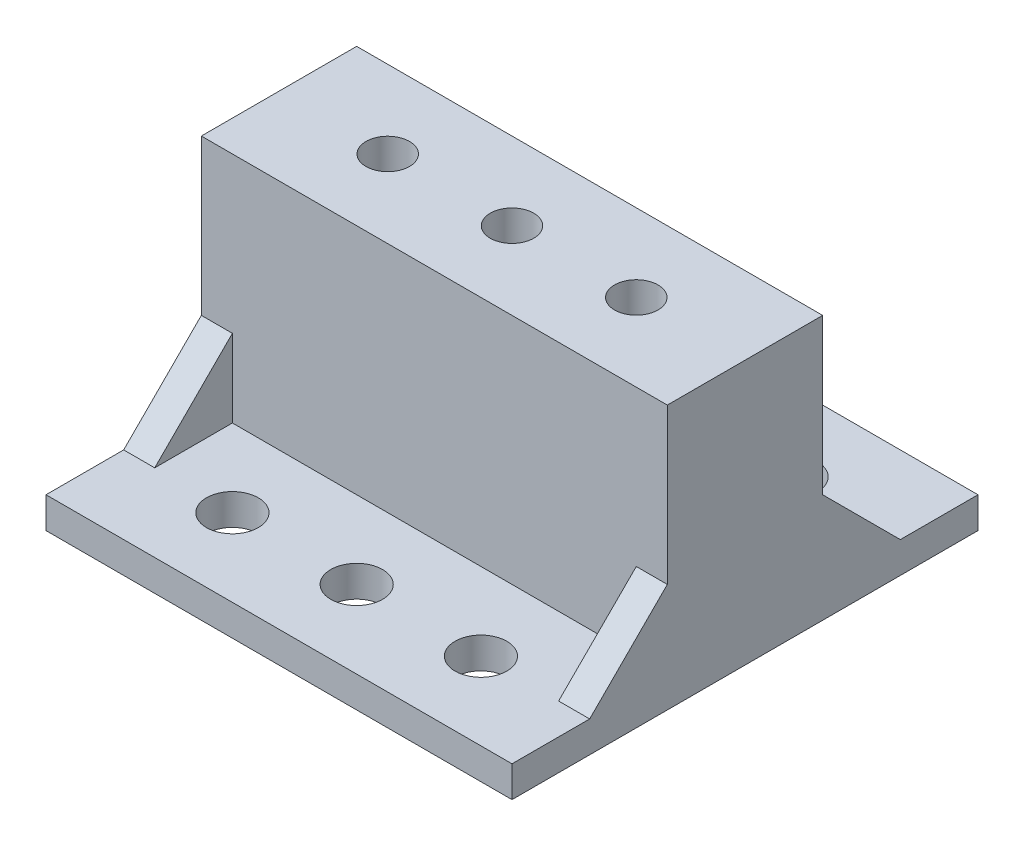
ISO-10303-21;
HEADER;
FILE_DESCRIPTION(('STEP AP214'),'2;1');
FILE_NAME('part.step','',(''),(''),'','','');
FILE_SCHEMA(('AUTOMOTIVE_DESIGN { 1 0 10303 214 1 1 1 1 }'));
ENDSEC;
DATA;
#1=APPLICATION_CONTEXT('core data for automotive mechanical design processes');
#2=APPLICATION_PROTOCOL_DEFINITION('international standard','automotive_design',2000,#1);
#3=PRODUCT_CONTEXT('',#1,'mechanical');
#4=PRODUCT('Part','Part','',(#3));
#5=PRODUCT_RELATED_PRODUCT_CATEGORY('part','',(#4));
#6=PRODUCT_DEFINITION_FORMATION('','',#4);
#7=PRODUCT_DEFINITION_CONTEXT('part definition',#1,'design');
#8=PRODUCT_DEFINITION('design','',#6,#7);
#9=PRODUCT_DEFINITION_SHAPE('','',#8);
#10=(LENGTH_UNIT() NAMED_UNIT(*) SI_UNIT(.MILLI.,.METRE.));
#11=(NAMED_UNIT(*) PLANE_ANGLE_UNIT() SI_UNIT($,.RADIAN.));
#12=(NAMED_UNIT(*) SI_UNIT($,.STERADIAN.) SOLID_ANGLE_UNIT());
#13=UNCERTAINTY_MEASURE_WITH_UNIT(LENGTH_MEASURE(1.E-05),#10,'distance_accuracy_value','');
#14=(GEOMETRIC_REPRESENTATION_CONTEXT(3) GLOBAL_UNCERTAINTY_ASSIGNED_CONTEXT((#13)) GLOBAL_UNIT_ASSIGNED_CONTEXT((#10,
#11,#12)) REPRESENTATION_CONTEXT('',''));
#15=CARTESIAN_POINT('',(0.,0.,0.));
#16=DIRECTION('',(0.,0.,1.));
#17=DIRECTION('',(1.,0.,0.));
#18=AXIS2_PLACEMENT_3D('',#15,#16,#17);
#19=CARTESIAN_POINT('',(0.,3.,0.));
#20=DIRECTION('',(0.,1.,0.));
#21=DIRECTION('',(0.,0.,1.));
#22=AXIS2_PLACEMENT_3D('',#19,#20,#21);
#23=PLANE('',#22);
#24=CARTESIAN_POINT('',(12.,3.,-15.));
#25=DIRECTION('',(0.,-1.,0.));
#26=DIRECTION('',(0.,0.,-1.));
#27=AXIS2_PLACEMENT_3D('',#24,#25,#26);
#28=CIRCLE('',#27,2.5);
#29=CARTESIAN_POINT('',(12.,3.,-17.5));
#30=VERTEX_POINT('',#29);
#31=EDGE_CURVE('E204',#30,#30,#28,.T.);
#32=ORIENTED_EDGE('',*,*,#31,.T.);
#33=EDGE_LOOP('',(#32));
#34=FACE_BOUND('',#33,.T.);
#35=CARTESIAN_POINT('',(-12.,3.,-15.));
#36=DIRECTION('',(0.,-1.,0.));
#37=DIRECTION('',(0.,0.,-1.));
#38=AXIS2_PLACEMENT_3D('',#35,#36,#37);
#39=CIRCLE('',#38,2.5);
#40=CARTESIAN_POINT('',(-12.,3.,-17.5));
#41=VERTEX_POINT('',#40);
#42=EDGE_CURVE('E210',#41,#41,#39,.T.);
#43=ORIENTED_EDGE('',*,*,#42,.T.);
#44=EDGE_LOOP('',(#43));
#45=FACE_BOUND('',#44,.T.);
#46=CARTESIAN_POINT('',(0.,3.,-15.));
#47=DIRECTION('',(0.,-1.,0.));
#48=DIRECTION('',(0.,0.,-1.));
#49=AXIS2_PLACEMENT_3D('',#46,#47,#48);
#50=CIRCLE('',#49,2.5);
#51=CARTESIAN_POINT('',(0.,3.,-17.5));
#52=VERTEX_POINT('',#51);
#53=EDGE_CURVE('E209',#52,#52,#50,.T.);
#54=ORIENTED_EDGE('',*,*,#53,.T.);
#55=EDGE_LOOP('',(#54));
#56=FACE_BOUND('',#55,.T.);
#57=DIRECTION('',(0.,0.,1.));
#58=VECTOR('',#57,1.);
#59=CARTESIAN_POINT('',(-22.5,3.,-22.5));
#60=LINE('',#59,#58);
#61=CARTESIAN_POINT('',(-22.5,3.,-22.5));
#62=VERTEX_POINT('',#61);
#63=CARTESIAN_POINT('',(-22.5,3.,-15.));
#64=VERTEX_POINT('',#63);
#65=EDGE_CURVE('E375',#62,#64,#60,.T.);
#66=ORIENTED_EDGE('',*,*,#65,.T.);
#67=DIRECTION('',(-1.,0.,0.));
#68=VECTOR('',#67,1.);
#69=CARTESIAN_POINT('',(-19.5,3.,-15.));
#70=LINE('',#69,#68);
#71=CARTESIAN_POINT('',(-19.5,3.,-15.));
#72=VERTEX_POINT('',#71);
#73=EDGE_CURVE('E265',#72,#64,#70,.T.);
#74=ORIENTED_EDGE('',*,*,#73,.F.);
#75=DIRECTION('',(0.,0.,-1.));
#76=VECTOR('',#75,1.);
#77=CARTESIAN_POINT('',(-19.5,3.,-7.49999999999998));
#78=LINE('',#77,#76);
#79=CARTESIAN_POINT('',(-19.5,3.,-7.49999999999998));
#80=VERTEX_POINT('',#79);
#81=EDGE_CURVE('E259',#80,#72,#78,.T.);
#82=ORIENTED_EDGE('',*,*,#81,.F.);
#83=DIRECTION('',(-1.,0.,0.));
#84=VECTOR('',#83,1.);
#85=CARTESIAN_POINT('',(22.5,3.,-7.49999999999999));
#86=LINE('',#85,#84);
#87=CARTESIAN_POINT('',(19.5,3.,-7.49999999999999));
#88=VERTEX_POINT('',#87);
#89=EDGE_CURVE('E336',#88,#80,#86,.T.);
#90=ORIENTED_EDGE('',*,*,#89,.F.);
#91=DIRECTION('',(0.,0.,-1.));
#92=VECTOR('',#91,1.);
#93=CARTESIAN_POINT('',(19.5,3.,-7.49999999999998));
#94=LINE('',#93,#92);
#95=CARTESIAN_POINT('',(19.5,3.,-15.));
#96=VERTEX_POINT('',#95);
#97=EDGE_CURVE('E67',#88,#96,#94,.T.);
#98=ORIENTED_EDGE('',*,*,#97,.T.);
#99=DIRECTION('',(1.,0.,0.));
#100=VECTOR('',#99,1.);
#101=CARTESIAN_POINT('',(19.5,3.,-15.));
#102=LINE('',#101,#100);
#103=CARTESIAN_POINT('',(22.5,3.,-15.));
#104=VERTEX_POINT('',#103);
#105=EDGE_CURVE('E71',#96,#104,#102,.T.);
#106=ORIENTED_EDGE('',*,*,#105,.T.);
#107=DIRECTION('',(0.,0.,-1.));
#108=VECTOR('',#107,1.);
#109=CARTESIAN_POINT('',(22.5,3.,-22.5));
#110=LINE('',#109,#108);
#111=CARTESIAN_POINT('',(22.5,3.,-22.5));
#112=VERTEX_POINT('',#111);
#113=EDGE_CURVE('E371',#104,#112,#110,.T.);
#114=ORIENTED_EDGE('',*,*,#113,.T.);
#115=DIRECTION('',(-1.,0.,0.));
#116=VECTOR('',#115,1.);
#117=CARTESIAN_POINT('',(-22.5,3.,-22.5));
#118=LINE('',#117,#116);
#119=EDGE_CURVE('E370',#112,#62,#118,.T.);
#120=ORIENTED_EDGE('',*,*,#119,.T.);
#121=EDGE_LOOP('',(#66,#74,#82,#90,#98,#106,#114,#120));
#122=FACE_BOUND('',#121,.T.);
#123=ADVANCED_FACE('F51',(#34,#45,#56,#122),#23,.T.);
#124=CARTESIAN_POINT('',(22.5,25.5,-7.49999999999999));
#125=DIRECTION('',(0.,0.,1.));
#126=DIRECTION('',(1.,0.,0.));
#127=AXIS2_PLACEMENT_3D('',#124,#125,#126);
#128=PLANE('',#127);
#129=DIRECTION('',(-1.,0.,0.));
#130=VECTOR('',#129,1.);
#131=CARTESIAN_POINT('',(-19.5,10.4999999999999,-7.49999999999999));
#132=LINE('',#131,#130);
#133=CARTESIAN_POINT('',(-19.5,10.4999999999999,-7.49999999999999));
#134=VERTEX_POINT('',#133);
#135=CARTESIAN_POINT('',(-22.5,10.4999999999999,-7.49999999999999));
#136=VERTEX_POINT('',#135);
#137=EDGE_CURVE('E262',#134,#136,#132,.T.);
#138=ORIENTED_EDGE('',*,*,#137,.T.);
#139=DIRECTION('',(0.,-1.,0.));
#140=VECTOR('',#139,1.);
#141=CARTESIAN_POINT('',(-22.5,25.5,-7.49999999999999));
#142=LINE('',#141,#140);
#143=CARTESIAN_POINT('',(-22.5,25.5,-7.49999999999999));
#144=VERTEX_POINT('',#143);
#145=EDGE_CURVE('E345',#144,#136,#142,.T.);
#146=ORIENTED_EDGE('',*,*,#145,.F.);
#147=DIRECTION('',(-1.,0.,0.));
#148=VECTOR('',#147,1.);
#149=CARTESIAN_POINT('',(22.5,25.5,-7.49999999999999));
#150=LINE('',#149,#148);
#151=CARTESIAN_POINT('',(22.5,25.5,-7.49999999999999));
#152=VERTEX_POINT('',#151);
#153=EDGE_CURVE('E342',#152,#144,#150,.T.);
#154=ORIENTED_EDGE('',*,*,#153,.F.);
#155=DIRECTION('',(0.,-1.,0.));
#156=VECTOR('',#155,1.);
#157=CARTESIAN_POINT('',(22.5,25.5,-7.49999999999999));
#158=LINE('',#157,#156);
#159=CARTESIAN_POINT('',(22.5,10.4999999999999,-7.49999999999999));
#160=VERTEX_POINT('',#159);
#161=EDGE_CURVE('E355',#152,#160,#158,.T.);
#162=ORIENTED_EDGE('',*,*,#161,.T.);
#163=DIRECTION('',(1.,0.,0.));
#164=VECTOR('',#163,1.);
#165=CARTESIAN_POINT('',(19.5,10.4999999999999,-7.49999999999999));
#166=LINE('',#165,#164);
#167=CARTESIAN_POINT('',(19.5,10.4999999999999,-7.49999999999999));
#168=VERTEX_POINT('',#167);
#169=EDGE_CURVE('E284',#168,#160,#166,.T.);
#170=ORIENTED_EDGE('',*,*,#169,.F.);
#171=DIRECTION('',(0.,-1.,0.));
#172=VECTOR('',#171,1.);
#173=CARTESIAN_POINT('',(19.5,10.4999999999999,-7.49999999999999));
#174=LINE('',#173,#172);
#175=EDGE_CURVE('E272',#168,#88,#174,.T.);
#176=ORIENTED_EDGE('',*,*,#175,.T.);
#177=ORIENTED_EDGE('',*,*,#89,.T.);
#178=DIRECTION('',(0.,-1.,0.));
#179=VECTOR('',#178,1.);
#180=CARTESIAN_POINT('',(-19.5,10.4999999999999,-7.49999999999999));
#181=LINE('',#180,#179);
#182=EDGE_CURVE('E253',#134,#80,#181,.T.);
#183=ORIENTED_EDGE('',*,*,#182,.F.);
#184=EDGE_LOOP('',(#138,#146,#154,#162,#170,#176,#177,#183));
#185=FACE_BOUND('',#184,.T.);
#186=ADVANCED_FACE('F443',(#185),#128,.F.);
#187=CARTESIAN_POINT('',(12.,3.,15.));
#188=DIRECTION('',(0.,1.,0.));
#189=DIRECTION('',(0.,0.,1.));
#190=AXIS2_PLACEMENT_3D('',#187,#188,#189);
#191=CIRCLE('',#190,2.5);
#192=CARTESIAN_POINT('',(12.,3.,17.5));
#193=VERTEX_POINT('',#192);
#194=EDGE_CURVE('E225',#193,#193,#191,.T.);
#195=ORIENTED_EDGE('',*,*,#194,.F.);
#196=EDGE_LOOP('',(#195));
#197=FACE_BOUND('',#196,.T.);
#198=CARTESIAN_POINT('',(-12.,3.,15.));
#199=DIRECTION('',(0.,1.,0.));
#200=DIRECTION('',(0.,0.,1.));
#201=AXIS2_PLACEMENT_3D('',#198,#199,#200);
#202=CIRCLE('',#201,2.5);
#203=CARTESIAN_POINT('',(-12.,3.,17.5));
#204=VERTEX_POINT('',#203);
#205=EDGE_CURVE('E234',#204,#204,#202,.T.);
#206=ORIENTED_EDGE('',*,*,#205,.F.);
#207=EDGE_LOOP('',(#206));
#208=FACE_BOUND('',#207,.T.);
#209=CARTESIAN_POINT('',(0.,3.,15.));
#210=DIRECTION('',(0.,1.,0.));
#211=DIRECTION('',(0.,0.,1.));
#212=AXIS2_PLACEMENT_3D('',#209,#210,#211);
#213=CIRCLE('',#212,2.5);
#214=CARTESIAN_POINT('',(0.,3.,17.5));
#215=VERTEX_POINT('',#214);
#216=EDGE_CURVE('E233',#215,#215,#213,.T.);
#217=ORIENTED_EDGE('',*,*,#216,.F.);
#218=EDGE_LOOP('',(#217));
#219=FACE_BOUND('',#218,.T.);
#220=CARTESIAN_POINT('',(22.5,3.,22.5));
#221=VERTEX_POINT('',#220);
#222=CARTESIAN_POINT('',(22.5,3.,15.));
#223=VERTEX_POINT('',#222);
#224=EDGE_CURVE('E366',#221,#223,#110,.T.);
#225=ORIENTED_EDGE('',*,*,#224,.T.);
#226=DIRECTION('',(1.,0.,0.));
#227=VECTOR('',#226,1.);
#228=CARTESIAN_POINT('',(19.5,3.,15.));
#229=LINE('',#228,#227);
#230=CARTESIAN_POINT('',(19.5,3.,15.));
#231=VERTEX_POINT('',#230);
#232=EDGE_CURVE('E303',#231,#223,#229,.T.);
#233=ORIENTED_EDGE('',*,*,#232,.F.);
#234=DIRECTION('',(0.,0.,1.));
#235=VECTOR('',#234,1.);
#236=CARTESIAN_POINT('',(19.5,3.,7.49999999999998));
#237=LINE('',#236,#235);
#238=CARTESIAN_POINT('',(19.5,3.,7.49999999999998));
#239=VERTEX_POINT('',#238);
#240=EDGE_CURVE('E297',#239,#231,#237,.T.);
#241=ORIENTED_EDGE('',*,*,#240,.F.);
#242=DIRECTION('',(1.,0.,0.));
#243=VECTOR('',#242,1.);
#244=CARTESIAN_POINT('',(22.5,3.,7.49999999999999));
#245=LINE('',#244,#243);
#246=CARTESIAN_POINT('',(-19.5,3.,7.49999999999999));
#247=VERTEX_POINT('',#246);
#248=EDGE_CURVE('E328',#247,#239,#245,.T.);
#249=ORIENTED_EDGE('',*,*,#248,.F.);
#250=DIRECTION('',(0.,0.,1.));
#251=VECTOR('',#250,1.);
#252=CARTESIAN_POINT('',(-19.5,3.,7.49999999999998));
#253=LINE('',#252,#251);
#254=CARTESIAN_POINT('',(-19.5,3.,15.));
#255=VERTEX_POINT('',#254);
#256=EDGE_CURVE('E313',#247,#255,#253,.T.);
#257=ORIENTED_EDGE('',*,*,#256,.T.);
#258=DIRECTION('',(-1.,0.,0.));
#259=VECTOR('',#258,1.);
#260=CARTESIAN_POINT('',(-19.5,3.,15.));
#261=LINE('',#260,#259);
#262=CARTESIAN_POINT('',(-22.5,3.,15.));
#263=VERTEX_POINT('',#262);
#264=EDGE_CURVE('E320',#255,#263,#261,.T.);
#265=ORIENTED_EDGE('',*,*,#264,.T.);
#266=CARTESIAN_POINT('',(-22.5,3.,22.5));
#267=VERTEX_POINT('',#266);
#268=EDGE_CURVE('E374',#263,#267,#60,.T.);
#269=ORIENTED_EDGE('',*,*,#268,.T.);
#270=DIRECTION('',(1.,0.,0.));
#271=VECTOR('',#270,1.);
#272=CARTESIAN_POINT('',(-22.5,3.,22.5));
#273=LINE('',#272,#271);
#274=EDGE_CURVE('E379',#267,#221,#273,.T.);
#275=ORIENTED_EDGE('',*,*,#274,.T.);
#276=EDGE_LOOP('',(#225,#233,#241,#249,#257,#265,#269,#275));
#277=FACE_BOUND('',#276,.T.);
#278=ADVANCED_FACE('F426',(#197,#208,#219,#277),#23,.T.);
#279=CARTESIAN_POINT('',(22.5,25.5,7.49999999999999));
#280=DIRECTION('',(0.,0.,-1.));
#281=DIRECTION('',(-1.,0.,0.));
#282=AXIS2_PLACEMENT_3D('',#279,#280,#281);
#283=PLANE('',#282);
#284=DIRECTION('',(1.,0.,0.));
#285=VECTOR('',#284,1.);
#286=CARTESIAN_POINT('',(19.5,10.4999999999999,7.49999999999999));
#287=LINE('',#286,#285);
#288=CARTESIAN_POINT('',(19.5,10.4999999999999,7.49999999999999));
#289=VERTEX_POINT('',#288);
#290=CARTESIAN_POINT('',(22.5,10.4999999999999,7.49999999999999));
#291=VERTEX_POINT('',#290);
#292=EDGE_CURVE('E300',#289,#291,#287,.T.);
#293=ORIENTED_EDGE('',*,*,#292,.T.);
#294=DIRECTION('',(0.,-1.,0.));
#295=VECTOR('',#294,1.);
#296=CARTESIAN_POINT('',(22.5,25.5,7.49999999999999));
#297=LINE('',#296,#295);
#298=CARTESIAN_POINT('',(22.5,25.5,7.49999999999999));
#299=VERTEX_POINT('',#298);
#300=EDGE_CURVE('E358',#299,#291,#297,.T.);
#301=ORIENTED_EDGE('',*,*,#300,.F.);
#302=DIRECTION('',(1.,0.,0.));
#303=VECTOR('',#302,1.);
#304=CARTESIAN_POINT('',(22.5,25.5,7.49999999999999));
#305=LINE('',#304,#303);
#306=CARTESIAN_POINT('',(-22.5,25.5,7.49999999999999));
#307=VERTEX_POINT('',#306);
#308=EDGE_CURVE('E335',#307,#299,#305,.T.);
#309=ORIENTED_EDGE('',*,*,#308,.F.);
#310=DIRECTION('',(0.,-1.,0.));
#311=VECTOR('',#310,1.);
#312=CARTESIAN_POINT('',(-22.5,25.5,7.49999999999999));
#313=LINE('',#312,#311);
#314=CARTESIAN_POINT('',(-22.5,10.4999999999999,7.49999999999999));
#315=VERTEX_POINT('',#314);
#316=EDGE_CURVE('E362',#307,#315,#313,.T.);
#317=ORIENTED_EDGE('',*,*,#316,.T.);
#318=DIRECTION('',(-1.,0.,0.));
#319=VECTOR('',#318,1.);
#320=CARTESIAN_POINT('',(-19.5,10.4999999999999,7.49999999999999));
#321=LINE('',#320,#319);
#322=CARTESIAN_POINT('',(-19.5,10.4999999999999,7.49999999999999));
#323=VERTEX_POINT('',#322);
#324=EDGE_CURVE('E324',#323,#315,#321,.T.);
#325=ORIENTED_EDGE('',*,*,#324,.F.);
#326=DIRECTION('',(0.,-1.,0.));
#327=VECTOR('',#326,1.);
#328=CARTESIAN_POINT('',(-19.5,10.4999999999999,7.49999999999999));
#329=LINE('',#328,#327);
#330=EDGE_CURVE('E310',#323,#247,#329,.T.);
#331=ORIENTED_EDGE('',*,*,#330,.T.);
#332=ORIENTED_EDGE('',*,*,#248,.T.);
#333=DIRECTION('',(0.,-1.,0.));
#334=VECTOR('',#333,1.);
#335=CARTESIAN_POINT('',(19.5,10.4999999999999,7.49999999999999));
#336=LINE('',#335,#334);
#337=EDGE_CURVE('E291',#289,#239,#336,.T.);
#338=ORIENTED_EDGE('',*,*,#337,.F.);
#339=EDGE_LOOP('',(#293,#301,#309,#317,#325,#331,#332,#338));
#340=FACE_BOUND('',#339,.T.);
#341=ADVANCED_FACE('F441',(#340),#283,.F.);
#342=CARTESIAN_POINT('',(22.5,3.,-22.5));
#343=DIRECTION('',(-1.,0.,0.));
#344=DIRECTION('',(0.,0.,1.));
#345=AXIS2_PLACEMENT_3D('',#342,#343,#344);
#346=PLANE('',#345);
#347=ORIENTED_EDGE('',*,*,#113,.F.);
#348=DIRECTION('',(0.,0.707106781186544,0.707106781186552));
#349=VECTOR('',#348,1.);
#350=CARTESIAN_POINT('',(22.5,3.,-15.));
#351=LINE('',#350,#349);
#352=EDGE_CURVE('E268',#104,#160,#351,.T.);
#353=ORIENTED_EDGE('',*,*,#352,.T.);
#354=ORIENTED_EDGE('',*,*,#161,.F.);
#355=DIRECTION('',(0.,0.,-1.));
#356=VECTOR('',#355,1.);
#357=CARTESIAN_POINT('',(22.5,25.5,-7.49999999999999));
#358=LINE('',#357,#356);
#359=EDGE_CURVE('E339',#299,#152,#358,.T.);
#360=ORIENTED_EDGE('',*,*,#359,.F.);
#361=ORIENTED_EDGE('',*,*,#300,.T.);
#362=DIRECTION('',(0.,0.707106781186544,-0.707106781186552));
#363=VECTOR('',#362,1.);
#364=CARTESIAN_POINT('',(22.5,3.,15.));
#365=LINE('',#364,#363);
#366=EDGE_CURVE('E288',#223,#291,#365,.T.);
#367=ORIENTED_EDGE('',*,*,#366,.F.);
#368=ORIENTED_EDGE('',*,*,#224,.F.);
#369=DIRECTION('',(0.,-1.,0.));
#370=VECTOR('',#369,1.);
#371=CARTESIAN_POINT('',(22.5,3.,22.5));
#372=LINE('',#371,#370);
#373=CARTESIAN_POINT('',(22.5,0.,22.5));
#374=VERTEX_POINT('',#373);
#375=EDGE_CURVE('E382',#221,#374,#372,.T.);
#376=ORIENTED_EDGE('',*,*,#375,.T.);
#377=DIRECTION('',(0.,0.,-1.));
#378=VECTOR('',#377,1.);
#379=CARTESIAN_POINT('',(22.5,0.,-22.5));
#380=LINE('',#379,#378);
#381=CARTESIAN_POINT('',(22.5,0.,-22.5));
#382=VERTEX_POINT('',#381);
#383=EDGE_CURVE('E365',#374,#382,#380,.T.);
#384=ORIENTED_EDGE('',*,*,#383,.T.);
#385=DIRECTION('',(0.,-1.,0.));
#386=VECTOR('',#385,1.);
#387=CARTESIAN_POINT('',(22.5,3.,-22.5));
#388=LINE('',#387,#386);
#389=EDGE_CURVE('E13',#112,#382,#388,.T.);
#390=ORIENTED_EDGE('',*,*,#389,.F.);
#391=EDGE_LOOP('',(#347,#353,#354,#360,#361,#367,#368,#376,#384,#390));
#392=FACE_BOUND('',#391,.T.);
#393=ADVANCED_FACE('F53',(#392),#346,.F.);
#394=CARTESIAN_POINT('',(-22.5,3.,-22.5));
#395=DIRECTION('',(0.,0.,1.));
#396=DIRECTION('',(1.,0.,0.));
#397=AXIS2_PLACEMENT_3D('',#394,#395,#396);
#398=PLANE('',#397);
#399=DIRECTION('',(-1.,0.,0.));
#400=VECTOR('',#399,1.);
#401=CARTESIAN_POINT('',(-22.5,0.,-22.5));
#402=LINE('',#401,#400);
#403=CARTESIAN_POINT('',(-22.5,0.,-22.5));
#404=VERTEX_POINT('',#403);
#405=EDGE_CURVE('E386',#382,#404,#402,.T.);
#406=ORIENTED_EDGE('',*,*,#405,.T.);
#407=DIRECTION('',(0.,-1.,0.));
#408=VECTOR('',#407,1.);
#409=CARTESIAN_POINT('',(-22.5,3.,-22.5));
#410=LINE('',#409,#408);
#411=EDGE_CURVE('E60',#62,#404,#410,.T.);
#412=ORIENTED_EDGE('',*,*,#411,.F.);
#413=ORIENTED_EDGE('',*,*,#119,.F.);
#414=ORIENTED_EDGE('',*,*,#389,.T.);
#415=EDGE_LOOP('',(#406,#412,#413,#414));
#416=FACE_BOUND('',#415,.T.);
#417=ADVANCED_FACE('F434',(#416),#398,.F.);
#418=CARTESIAN_POINT('',(-22.5,3.,-22.5));
#419=DIRECTION('',(1.,0.,0.));
#420=DIRECTION('',(0.,0.,-1.));
#421=AXIS2_PLACEMENT_3D('',#418,#419,#420);
#422=PLANE('',#421);
#423=DIRECTION('',(0.,0.707106781186544,0.707106781186552));
#424=VECTOR('',#423,1.);
#425=CARTESIAN_POINT('',(-22.5,3.,-15.));
#426=LINE('',#425,#424);
#427=EDGE_CURVE('E249',#64,#136,#426,.T.);
#428=ORIENTED_EDGE('',*,*,#427,.F.);
#429=ORIENTED_EDGE('',*,*,#65,.F.);
#430=ORIENTED_EDGE('',*,*,#411,.T.);
#431=DIRECTION('',(0.,0.,1.));
#432=VECTOR('',#431,1.);
#433=CARTESIAN_POINT('',(-22.5,0.,-22.5));
#434=LINE('',#433,#432);
#435=CARTESIAN_POINT('',(-22.5,0.,22.5));
#436=VERTEX_POINT('',#435);
#437=EDGE_CURVE('E389',#404,#436,#434,.T.);
#438=ORIENTED_EDGE('',*,*,#437,.T.);
#439=DIRECTION('',(0.,-1.,0.));
#440=VECTOR('',#439,1.);
#441=CARTESIAN_POINT('',(-22.5,3.,22.5));
#442=LINE('',#441,#440);
#443=EDGE_CURVE('E398',#267,#436,#442,.T.);
#444=ORIENTED_EDGE('',*,*,#443,.F.);
#445=ORIENTED_EDGE('',*,*,#268,.F.);
#446=DIRECTION('',(0.,0.707106781186544,-0.707106781186552));
#447=VECTOR('',#446,1.);
#448=CARTESIAN_POINT('',(-22.5,3.,15.));
#449=LINE('',#448,#447);
#450=EDGE_CURVE('E306',#263,#315,#449,.T.);
#451=ORIENTED_EDGE('',*,*,#450,.T.);
#452=ORIENTED_EDGE('',*,*,#316,.F.);
#453=DIRECTION('',(0.,0.,1.));
#454=VECTOR('',#453,1.);
#455=CARTESIAN_POINT('',(-22.5,25.5,-7.49999999999999));
#456=LINE('',#455,#454);
#457=EDGE_CURVE('E331',#144,#307,#456,.T.);
#458=ORIENTED_EDGE('',*,*,#457,.F.);
#459=ORIENTED_EDGE('',*,*,#145,.T.);
#460=EDGE_LOOP('',(#428,#429,#430,#438,#444,#445,#451,#452,#458,#459));
#461=FACE_BOUND('',#460,.T.);
#462=ADVANCED_FACE('F408',(#461),#422,.F.);
#463=CARTESIAN_POINT('',(-22.5,3.,22.5));
#464=DIRECTION('',(0.,0.,-1.));
#465=DIRECTION('',(-1.,0.,0.));
#466=AXIS2_PLACEMENT_3D('',#463,#464,#465);
#467=PLANE('',#466);
#468=DIRECTION('',(1.,0.,0.));
#469=VECTOR('',#468,1.);
#470=CARTESIAN_POINT('',(-22.5,0.,22.5));
#471=LINE('',#470,#469);
#472=EDGE_CURVE('E392',#436,#374,#471,.T.);
#473=ORIENTED_EDGE('',*,*,#472,.T.);
#474=ORIENTED_EDGE('',*,*,#375,.F.);
#475=ORIENTED_EDGE('',*,*,#274,.F.);
#476=ORIENTED_EDGE('',*,*,#443,.T.);
#477=EDGE_LOOP('',(#473,#474,#475,#476));
#478=FACE_BOUND('',#477,.T.);
#479=ADVANCED_FACE('F418',(#478),#467,.F.);
#480=CARTESIAN_POINT('',(0.,0.,0.));
#481=DIRECTION('',(0.,1.,0.));
#482=DIRECTION('',(0.,0.,1.));
#483=AXIS2_PLACEMENT_3D('',#480,#481,#482);
#484=PLANE('',#483);
#485=CARTESIAN_POINT('',(12.,0.,-15.));
#486=DIRECTION('',(0.,-1.,0.));
#487=DIRECTION('',(0.,0.,-1.));
#488=AXIS2_PLACEMENT_3D('',#485,#486,#487);
#489=CIRCLE('',#488,2.5);
#490=CARTESIAN_POINT('',(12.,0.,-17.5));
#491=VERTEX_POINT('',#490);
#492=EDGE_CURVE('E214',#491,#491,#489,.T.);
#493=ORIENTED_EDGE('',*,*,#492,.F.);
#494=EDGE_LOOP('',(#493));
#495=FACE_BOUND('',#494,.T.);
#496=CARTESIAN_POINT('',(-12.,0.,-15.));
#497=DIRECTION('',(0.,-1.,0.));
#498=DIRECTION('',(0.,0.,-1.));
#499=AXIS2_PLACEMENT_3D('',#496,#497,#498);
#500=CIRCLE('',#499,2.5);
#501=CARTESIAN_POINT('',(-12.,0.,-17.5));
#502=VERTEX_POINT('',#501);
#503=EDGE_CURVE('E205',#502,#502,#500,.T.);
#504=ORIENTED_EDGE('',*,*,#503,.F.);
#505=EDGE_LOOP('',(#504));
#506=FACE_BOUND('',#505,.T.);
#507=CARTESIAN_POINT('',(0.,0.,-15.));
#508=DIRECTION('',(0.,-1.,0.));
#509=DIRECTION('',(0.,0.,-1.));
#510=AXIS2_PLACEMENT_3D('',#507,#508,#509);
#511=CIRCLE('',#510,2.5);
#512=CARTESIAN_POINT('',(0.,0.,-17.5));
#513=VERTEX_POINT('',#512);
#514=EDGE_CURVE('E221',#513,#513,#511,.T.);
#515=ORIENTED_EDGE('',*,*,#514,.F.);
#516=EDGE_LOOP('',(#515));
#517=FACE_BOUND('',#516,.T.);
#518=CARTESIAN_POINT('',(12.,0.,15.));
#519=DIRECTION('',(0.,1.,0.));
#520=DIRECTION('',(0.,0.,1.));
#521=AXIS2_PLACEMENT_3D('',#518,#519,#520);
#522=CIRCLE('',#521,2.5);
#523=CARTESIAN_POINT('',(12.,0.,17.5));
#524=VERTEX_POINT('',#523);
#525=EDGE_CURVE('E238',#524,#524,#522,.T.);
#526=ORIENTED_EDGE('',*,*,#525,.T.);
#527=EDGE_LOOP('',(#526));
#528=FACE_BOUND('',#527,.T.);
#529=CARTESIAN_POINT('',(-12.,0.,15.));
#530=DIRECTION('',(0.,1.,0.));
#531=DIRECTION('',(0.,0.,1.));
#532=AXIS2_PLACEMENT_3D('',#529,#530,#531);
#533=CIRCLE('',#532,2.5);
#534=CARTESIAN_POINT('',(-12.,0.,17.5));
#535=VERTEX_POINT('',#534);
#536=EDGE_CURVE('E229',#535,#535,#533,.T.);
#537=ORIENTED_EDGE('',*,*,#536,.T.);
#538=EDGE_LOOP('',(#537));
#539=FACE_BOUND('',#538,.T.);
#540=CARTESIAN_POINT('',(0.,0.,15.));
#541=DIRECTION('',(0.,1.,0.));
#542=DIRECTION('',(0.,0.,1.));
#543=AXIS2_PLACEMENT_3D('',#540,#541,#542);
#544=CIRCLE('',#543,2.5);
#545=CARTESIAN_POINT('',(0.,0.,17.5));
#546=VERTEX_POINT('',#545);
#547=EDGE_CURVE('E245',#546,#546,#544,.T.);
#548=ORIENTED_EDGE('',*,*,#547,.T.);
#549=EDGE_LOOP('',(#548));
#550=FACE_BOUND('',#549,.T.);
#551=ORIENTED_EDGE('',*,*,#383,.F.);
#552=ORIENTED_EDGE('',*,*,#472,.F.);
#553=ORIENTED_EDGE('',*,*,#437,.F.);
#554=ORIENTED_EDGE('',*,*,#405,.F.);
#555=EDGE_LOOP('',(#551,#552,#553,#554));
#556=FACE_BOUND('',#555,.T.);
#557=ADVANCED_FACE('F415',(#495,#506,#517,#528,#539,#550,#556),#484,.F.);
#558=CARTESIAN_POINT('',(0.,25.5,0.));
#559=DIRECTION('',(0.,-1.,0.));
#560=DIRECTION('',(0.,0.,-1.));
#561=AXIS2_PLACEMENT_3D('',#558,#559,#560);
#562=PLANE('',#561);
#563=CARTESIAN_POINT('',(0.,25.5,0.));
#564=DIRECTION('',(0.,1.,0.));
#565=DIRECTION('',(0.,0.,1.));
#566=AXIS2_PLACEMENT_3D('',#563,#564,#565);
#567=CIRCLE('',#566,2.1);
#568=CARTESIAN_POINT('',(0.,25.5,2.1));
#569=VERTEX_POINT('',#568);
#570=EDGE_CURVE('E183',#569,#569,#567,.T.);
#571=ORIENTED_EDGE('',*,*,#570,.F.);
#572=EDGE_LOOP('',(#571));
#573=FACE_BOUND('',#572,.T.);
#574=CARTESIAN_POINT('',(12.,25.5,0.));
#575=DIRECTION('',(0.,1.,0.));
#576=DIRECTION('',(0.,0.,1.));
#577=AXIS2_PLACEMENT_3D('',#574,#575,#576);
#578=CIRCLE('',#577,2.1);
#579=CARTESIAN_POINT('',(12.,25.5,2.1));
#580=VERTEX_POINT('',#579);
#581=EDGE_CURVE('E182',#580,#580,#578,.T.);
#582=ORIENTED_EDGE('',*,*,#581,.F.);
#583=EDGE_LOOP('',(#582));
#584=FACE_BOUND('',#583,.T.);
#585=CARTESIAN_POINT('',(-12.,25.5,0.));
#586=DIRECTION('',(0.,1.,0.));
#587=DIRECTION('',(0.,0.,1.));
#588=AXIS2_PLACEMENT_3D('',#585,#586,#587);
#589=CIRCLE('',#588,2.1);
#590=CARTESIAN_POINT('',(-12.,25.5,2.1));
#591=VERTEX_POINT('',#590);
#592=EDGE_CURVE('E196',#591,#591,#589,.T.);
#593=ORIENTED_EDGE('',*,*,#592,.F.);
#594=EDGE_LOOP('',(#593));
#595=FACE_BOUND('',#594,.T.);
#596=ORIENTED_EDGE('',*,*,#457,.T.);
#597=ORIENTED_EDGE('',*,*,#308,.T.);
#598=ORIENTED_EDGE('',*,*,#359,.T.);
#599=ORIENTED_EDGE('',*,*,#153,.T.);
#600=EDGE_LOOP('',(#596,#597,#598,#599));
#601=FACE_BOUND('',#600,.T.);
#602=ADVANCED_FACE('F511',(#573,#584,#595,#601),#562,.F.);
#603=CARTESIAN_POINT('',(-19.5,3.,15.));
#604=DIRECTION('',(0.,0.707106781186551,0.707106781186544));
#605=DIRECTION('',(0.,-0.707106781186544,0.707106781186551));
#606=AXIS2_PLACEMENT_3D('',#603,#604,#605);
#607=PLANE('',#606);
#608=ORIENTED_EDGE('',*,*,#450,.F.);
#609=ORIENTED_EDGE('',*,*,#264,.F.);
#610=DIRECTION('',(0.,0.707106781186544,-0.707106781186552));
#611=VECTOR('',#610,1.);
#612=CARTESIAN_POINT('',(-19.5,3.,15.));
#613=LINE('',#612,#611);
#614=EDGE_CURVE('E316',#255,#323,#613,.T.);
#615=ORIENTED_EDGE('',*,*,#614,.T.);
#616=ORIENTED_EDGE('',*,*,#324,.T.);
#617=EDGE_LOOP('',(#608,#609,#615,#616));
#618=FACE_BOUND('',#617,.T.);
#619=ADVANCED_FACE('F507',(#618),#607,.T.);
#620=CARTESIAN_POINT('',(-19.5,0.,0.));
#621=DIRECTION('',(-1.,0.,0.));
#622=DIRECTION('',(0.,0.,1.));
#623=AXIS2_PLACEMENT_3D('',#620,#621,#622);
#624=PLANE('',#623);
#625=ORIENTED_EDGE('',*,*,#330,.F.);
#626=ORIENTED_EDGE('',*,*,#614,.F.);
#627=ORIENTED_EDGE('',*,*,#256,.F.);
#628=EDGE_LOOP('',(#625,#626,#627));
#629=FACE_BOUND('',#628,.T.);
#630=ADVANCED_FACE('F503',(#629),#624,.F.);
#631=CARTESIAN_POINT('',(19.5,3.,15.));
#632=DIRECTION('',(0.,-0.707106781186551,-0.707106781186544));
#633=DIRECTION('',(0.,0.707106781186544,-0.707106781186551));
#634=AXIS2_PLACEMENT_3D('',#631,#632,#633);
#635=PLANE('',#634);
#636=ORIENTED_EDGE('',*,*,#366,.T.);
#637=ORIENTED_EDGE('',*,*,#292,.F.);
#638=DIRECTION('',(0.,0.707106781186544,-0.707106781186552));
#639=VECTOR('',#638,1.);
#640=CARTESIAN_POINT('',(19.5,3.,15.));
#641=LINE('',#640,#639);
#642=EDGE_CURVE('E294',#231,#289,#641,.T.);
#643=ORIENTED_EDGE('',*,*,#642,.F.);
#644=ORIENTED_EDGE('',*,*,#232,.T.);
#645=EDGE_LOOP('',(#636,#637,#643,#644));
#646=FACE_BOUND('',#645,.T.);
#647=ADVANCED_FACE('F499',(#646),#635,.F.);
#648=CARTESIAN_POINT('',(19.5,0.,0.));
#649=DIRECTION('',(1.,0.,0.));
#650=DIRECTION('',(0.,0.,1.));
#651=AXIS2_PLACEMENT_3D('',#648,#649,#650);
#652=PLANE('',#651);
#653=ORIENTED_EDGE('',*,*,#337,.T.);
#654=ORIENTED_EDGE('',*,*,#240,.T.);
#655=ORIENTED_EDGE('',*,*,#642,.T.);
#656=EDGE_LOOP('',(#653,#654,#655));
#657=FACE_BOUND('',#656,.T.);
#658=ADVANCED_FACE('F495',(#657),#652,.F.);
#659=CARTESIAN_POINT('',(19.5,3.,-15.));
#660=DIRECTION('',(0.,0.707106781186551,-0.707106781186544));
#661=DIRECTION('',(0.,0.707106781186544,0.707106781186551));
#662=AXIS2_PLACEMENT_3D('',#659,#660,#661);
#663=PLANE('',#662);
#664=ORIENTED_EDGE('',*,*,#352,.F.);
#665=ORIENTED_EDGE('',*,*,#105,.F.);
#666=DIRECTION('',(0.,0.707106781186544,0.707106781186552));
#667=VECTOR('',#666,1.);
#668=CARTESIAN_POINT('',(19.5,3.,-15.));
#669=LINE('',#668,#667);
#670=EDGE_CURVE('E277',#96,#168,#669,.T.);
#671=ORIENTED_EDGE('',*,*,#670,.T.);
#672=ORIENTED_EDGE('',*,*,#169,.T.);
#673=EDGE_LOOP('',(#664,#665,#671,#672));
#674=FACE_BOUND('',#673,.T.);
#675=ADVANCED_FACE('F491',(#674),#663,.T.);
#676=CARTESIAN_POINT('',(19.5,0.,0.));
#677=DIRECTION('',(1.,0.,0.));
#678=DIRECTION('',(0.,0.,-1.));
#679=AXIS2_PLACEMENT_3D('',#676,#677,#678);
#680=PLANE('',#679);
#681=ORIENTED_EDGE('',*,*,#175,.F.);
#682=ORIENTED_EDGE('',*,*,#670,.F.);
#683=ORIENTED_EDGE('',*,*,#97,.F.);
#684=EDGE_LOOP('',(#681,#682,#683));
#685=FACE_BOUND('',#684,.T.);
#686=ADVANCED_FACE('F487',(#685),#680,.F.);
#687=CARTESIAN_POINT('',(-19.5,3.,-15.));
#688=DIRECTION('',(0.,-0.707106781186551,0.707106781186544));
#689=DIRECTION('',(0.,-0.707106781186544,-0.707106781186551));
#690=AXIS2_PLACEMENT_3D('',#687,#688,#689);
#691=PLANE('',#690);
#692=ORIENTED_EDGE('',*,*,#427,.T.);
#693=ORIENTED_EDGE('',*,*,#137,.F.);
#694=DIRECTION('',(0.,0.707106781186544,0.707106781186552));
#695=VECTOR('',#694,1.);
#696=CARTESIAN_POINT('',(-19.5,3.,-15.));
#697=LINE('',#696,#695);
#698=EDGE_CURVE('E256',#72,#134,#697,.T.);
#699=ORIENTED_EDGE('',*,*,#698,.F.);
#700=ORIENTED_EDGE('',*,*,#73,.T.);
#701=EDGE_LOOP('',(#692,#693,#699,#700));
#702=FACE_BOUND('',#701,.T.);
#703=ADVANCED_FACE('F479',(#702),#691,.F.);
#704=CARTESIAN_POINT('',(-19.5,0.,0.));
#705=DIRECTION('',(-1.,0.,0.));
#706=DIRECTION('',(0.,0.,-1.));
#707=AXIS2_PLACEMENT_3D('',#704,#705,#706);
#708=PLANE('',#707);
#709=ORIENTED_EDGE('',*,*,#182,.T.);
#710=ORIENTED_EDGE('',*,*,#81,.T.);
#711=ORIENTED_EDGE('',*,*,#698,.T.);
#712=EDGE_LOOP('',(#709,#710,#711));
#713=FACE_BOUND('',#712,.T.);
#714=ADVANCED_FACE('F469',(#713),#708,.F.);
#715=CARTESIAN_POINT('',(0.,0.,15.));
#716=DIRECTION('',(0.,1.,0.));
#717=DIRECTION('',(0.,0.,1.));
#718=AXIS2_PLACEMENT_3D('',#715,#716,#717);
#719=CYLINDRICAL_SURFACE('',#718,2.5);
#720=ORIENTED_EDGE('',*,*,#547,.F.);
#721=EDGE_LOOP('',(#720));
#722=FACE_BOUND('',#721,.T.);
#723=ORIENTED_EDGE('',*,*,#216,.T.);
#724=EDGE_LOOP('',(#723));
#725=FACE_BOUND('',#724,.T.);
#726=ADVANCED_FACE('F466',(#722,#725),#719,.F.);
#727=CARTESIAN_POINT('',(-12.,0.,15.));
#728=DIRECTION('',(0.,1.,0.));
#729=DIRECTION('',(0.,0.,1.));
#730=AXIS2_PLACEMENT_3D('',#727,#728,#729);
#731=CYLINDRICAL_SURFACE('',#730,2.5);
#732=ORIENTED_EDGE('',*,*,#536,.F.);
#733=EDGE_LOOP('',(#732));
#734=FACE_BOUND('',#733,.T.);
#735=ORIENTED_EDGE('',*,*,#205,.T.);
#736=EDGE_LOOP('',(#735));
#737=FACE_BOUND('',#736,.T.);
#738=ADVANCED_FACE('F468',(#734,#737),#731,.F.);
#739=CARTESIAN_POINT('',(12.,0.,15.));
#740=DIRECTION('',(0.,1.,0.));
#741=DIRECTION('',(0.,0.,1.));
#742=AXIS2_PLACEMENT_3D('',#739,#740,#741);
#743=CYLINDRICAL_SURFACE('',#742,2.5);
#744=ORIENTED_EDGE('',*,*,#525,.F.);
#745=EDGE_LOOP('',(#744));
#746=FACE_BOUND('',#745,.T.);
#747=ORIENTED_EDGE('',*,*,#194,.T.);
#748=EDGE_LOOP('',(#747));
#749=FACE_BOUND('',#748,.T.);
#750=ADVANCED_FACE('F476',(#746,#749),#743,.F.);
#751=CARTESIAN_POINT('',(0.,0.,-15.));
#752=DIRECTION('',(0.,1.,0.));
#753=DIRECTION('',(0.,0.,1.));
#754=AXIS2_PLACEMENT_3D('',#751,#752,#753);
#755=CYLINDRICAL_SURFACE('',#754,2.5);
#756=ORIENTED_EDGE('',*,*,#514,.T.);
#757=EDGE_LOOP('',(#756));
#758=FACE_BOUND('',#757,.T.);
#759=ORIENTED_EDGE('',*,*,#53,.F.);
#760=EDGE_LOOP('',(#759));
#761=FACE_BOUND('',#760,.T.);
#762=ADVANCED_FACE('F568',(#758,#761),#755,.F.);
#763=CARTESIAN_POINT('',(-12.,0.,-15.));
#764=DIRECTION('',(0.,1.,0.));
#765=DIRECTION('',(0.,0.,1.));
#766=AXIS2_PLACEMENT_3D('',#763,#764,#765);
#767=CYLINDRICAL_SURFACE('',#766,2.5);
#768=ORIENTED_EDGE('',*,*,#503,.T.);
#769=EDGE_LOOP('',(#768));
#770=FACE_BOUND('',#769,.T.);
#771=ORIENTED_EDGE('',*,*,#42,.F.);
#772=EDGE_LOOP('',(#771));
#773=FACE_BOUND('',#772,.T.);
#774=ADVANCED_FACE('F565',(#770,#773),#767,.F.);
#775=CARTESIAN_POINT('',(12.,0.,-15.));
#776=DIRECTION('',(0.,1.,0.));
#777=DIRECTION('',(0.,0.,1.));
#778=AXIS2_PLACEMENT_3D('',#775,#776,#777);
#779=CYLINDRICAL_SURFACE('',#778,2.5);
#780=ORIENTED_EDGE('',*,*,#492,.T.);
#781=EDGE_LOOP('',(#780));
#782=FACE_BOUND('',#781,.T.);
#783=ORIENTED_EDGE('',*,*,#31,.F.);
#784=EDGE_LOOP('',(#783));
#785=FACE_BOUND('',#784,.T.);
#786=ADVANCED_FACE('F559',(#782,#785),#779,.F.);
#787=CARTESIAN_POINT('',(-12.,7.5,0.));
#788=DIRECTION('',(0.,1.,0.));
#789=DIRECTION('',(0.,0.,1.));
#790=AXIS2_PLACEMENT_3D('',#787,#788,#789);
#791=CONICAL_SURFACE('',#790,2.1,1.02974425867665);
#792=CARTESIAN_POINT('',(-12.,6.23819270004212,0.));
#793=VERTEX_POINT('',#792);
#794=VERTEX_LOOP('',#793);
#795=FACE_BOUND('',#794,.T.);
#796=CARTESIAN_POINT('',(-12.,7.5,0.));
#797=DIRECTION('',(0.,1.,0.));
#798=DIRECTION('',(0.,0.,1.));
#799=AXIS2_PLACEMENT_3D('',#796,#797,#798);
#800=CIRCLE('',#799,2.1);
#801=CARTESIAN_POINT('',(-12.,7.5,2.1));
#802=VERTEX_POINT('',#801);
#803=EDGE_CURVE('E200',#802,#802,#800,.T.);
#804=ORIENTED_EDGE('',*,*,#803,.T.);
#805=EDGE_LOOP('',(#804));
#806=FACE_BOUND('',#805,.T.);
#807=ADVANCED_FACE('F550',(#795,#806),#791,.F.);
#808=CARTESIAN_POINT('',(-12.,25.5,0.));
#809=DIRECTION('',(0.,1.,0.));
#810=DIRECTION('',(0.,0.,1.));
#811=AXIS2_PLACEMENT_3D('',#808,#809,#810);
#812=CYLINDRICAL_SURFACE('',#811,2.1);
#813=ORIENTED_EDGE('',*,*,#803,.F.);
#814=EDGE_LOOP('',(#813));
#815=FACE_BOUND('',#814,.T.);
#816=ORIENTED_EDGE('',*,*,#592,.T.);
#817=EDGE_LOOP('',(#816));
#818=FACE_BOUND('',#817,.T.);
#819=ADVANCED_FACE('F547',(#815,#818),#812,.F.);
#820=CARTESIAN_POINT('',(12.,7.5,0.));
#821=DIRECTION('',(0.,1.,0.));
#822=DIRECTION('',(0.,0.,1.));
#823=AXIS2_PLACEMENT_3D('',#820,#821,#822);
#824=CONICAL_SURFACE('',#823,2.1,1.02974425867665);
#825=CARTESIAN_POINT('',(12.,6.23819270004212,0.));
#826=VERTEX_POINT('',#825);
#827=VERTEX_LOOP('',#826);
#828=FACE_BOUND('',#827,.T.);
#829=CARTESIAN_POINT('',(12.,7.5,0.));
#830=DIRECTION('',(0.,1.,0.));
#831=DIRECTION('',(0.,0.,1.));
#832=AXIS2_PLACEMENT_3D('',#829,#830,#831);
#833=CIRCLE('',#832,2.1);
#834=CARTESIAN_POINT('',(12.,7.5,2.1));
#835=VERTEX_POINT('',#834);
#836=EDGE_CURVE('E188',#835,#835,#833,.T.);
#837=ORIENTED_EDGE('',*,*,#836,.T.);
#838=EDGE_LOOP('',(#837));
#839=FACE_BOUND('',#838,.T.);
#840=ADVANCED_FACE('F549',(#828,#839),#824,.F.);
#841=CARTESIAN_POINT('',(12.,25.5,0.));
#842=DIRECTION('',(0.,1.,0.));
#843=DIRECTION('',(0.,0.,1.));
#844=AXIS2_PLACEMENT_3D('',#841,#842,#843);
#845=CYLINDRICAL_SURFACE('',#844,2.1);
#846=ORIENTED_EDGE('',*,*,#836,.F.);
#847=EDGE_LOOP('',(#846));
#848=FACE_BOUND('',#847,.T.);
#849=ORIENTED_EDGE('',*,*,#581,.T.);
#850=EDGE_LOOP('',(#849));
#851=FACE_BOUND('',#850,.T.);
#852=ADVANCED_FACE('F175',(#848,#851),#845,.F.);
#853=CARTESIAN_POINT('',(0.,7.5,0.));
#854=DIRECTION('',(0.,1.,0.));
#855=DIRECTION('',(0.,0.,1.));
#856=AXIS2_PLACEMENT_3D('',#853,#854,#855);
#857=CONICAL_SURFACE('',#856,2.1,1.02974425867665);
#858=CARTESIAN_POINT('',(0.,6.23819270004212,0.));
#859=VERTEX_POINT('',#858);
#860=VERTEX_LOOP('',#859);
#861=FACE_BOUND('',#860,.T.);
#862=CARTESIAN_POINT('',(0.,7.5,0.));
#863=DIRECTION('',(0.,1.,0.));
#864=DIRECTION('',(0.,0.,1.));
#865=AXIS2_PLACEMENT_3D('',#862,#863,#864);
#866=CIRCLE('',#865,2.1);
#867=CARTESIAN_POINT('',(0.,7.5,2.1));
#868=VERTEX_POINT('',#867);
#869=EDGE_CURVE('E179',#868,#868,#866,.T.);
#870=ORIENTED_EDGE('',*,*,#869,.T.);
#871=EDGE_LOOP('',(#870));
#872=FACE_BOUND('',#871,.T.);
#873=ADVANCED_FACE('F171',(#861,#872),#857,.F.);
#874=CARTESIAN_POINT('',(0.,25.5,0.));
#875=DIRECTION('',(0.,1.,0.));
#876=DIRECTION('',(0.,0.,1.));
#877=AXIS2_PLACEMENT_3D('',#874,#875,#876);
#878=CYLINDRICAL_SURFACE('',#877,2.1);
#879=ORIENTED_EDGE('',*,*,#869,.F.);
#880=EDGE_LOOP('',(#879));
#881=FACE_BOUND('',#880,.T.);
#882=ORIENTED_EDGE('',*,*,#570,.T.);
#883=EDGE_LOOP('',(#882));
#884=FACE_BOUND('',#883,.T.);
#885=ADVANCED_FACE('F174',(#881,#884),#878,.F.);
#886=CLOSED_SHELL('',(#123,#186,#278,#341,#393,#417,#462,#479,#557,#602,#619,#630,#647,#658,
#675,#686,#703,#714,#726,#738,#750,#762,#774,#786,#807,#819,#840,#852,#873,#885));
#887=MANIFOLD_SOLID_BREP('B2',#886);
#888=ADVANCED_BREP_SHAPE_REPRESENTATION('',(#18,#887),#14);
#889=SHAPE_DEFINITION_REPRESENTATION(#9,#888);
ENDSEC;
END-ISO-10303-21;
